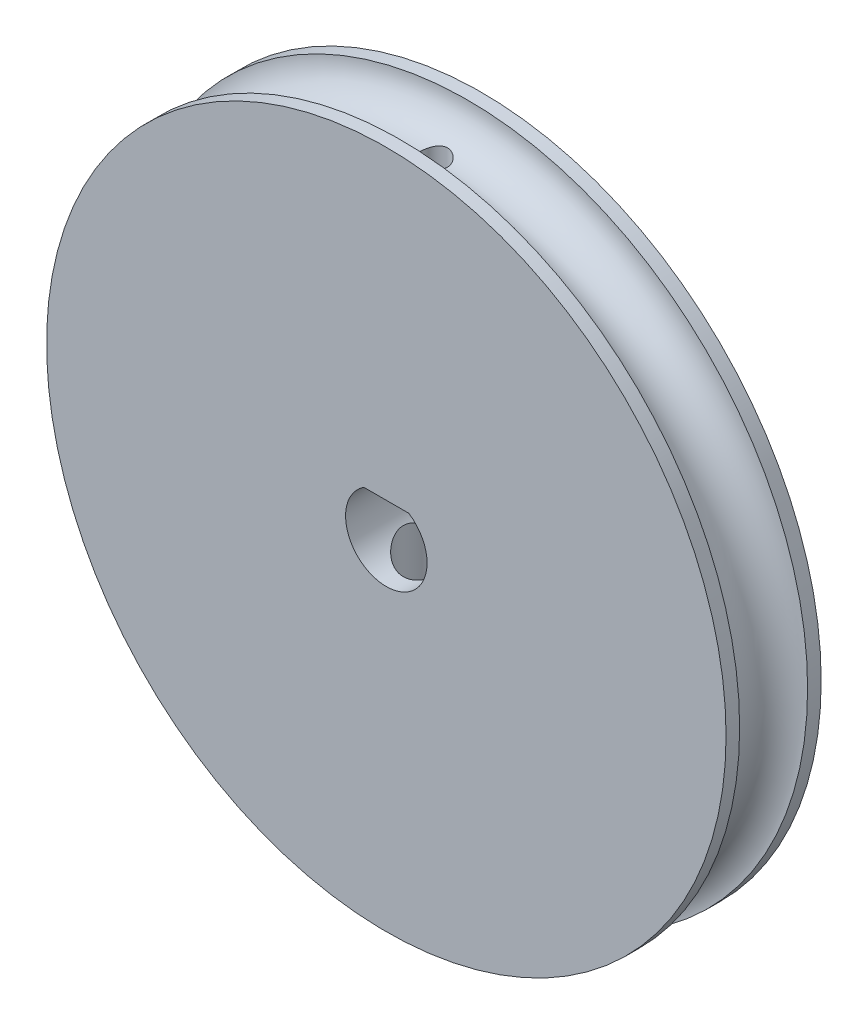
ISO-10303-21;
HEADER;
FILE_DESCRIPTION(('STEP AP214'),'2;1');
FILE_NAME('part.step','',(''),(''),'','','');
FILE_SCHEMA(('AUTOMOTIVE_DESIGN { 1 0 10303 214 1 1 1 1 }'));
ENDSEC;
DATA;
#1=APPLICATION_CONTEXT('core data for automotive mechanical design processes');
#2=APPLICATION_PROTOCOL_DEFINITION('international standard','automotive_design',2000,#1);
#3=PRODUCT_CONTEXT('',#1,'mechanical');
#4=PRODUCT('Part','Part','',(#3));
#5=PRODUCT_RELATED_PRODUCT_CATEGORY('part','',(#4));
#6=PRODUCT_DEFINITION_FORMATION('','',#4);
#7=PRODUCT_DEFINITION_CONTEXT('part definition',#1,'design');
#8=PRODUCT_DEFINITION('design','',#6,#7);
#9=PRODUCT_DEFINITION_SHAPE('','',#8);
#10=(LENGTH_UNIT() NAMED_UNIT(*) SI_UNIT(.MILLI.,.METRE.));
#11=(NAMED_UNIT(*) PLANE_ANGLE_UNIT() SI_UNIT($,.RADIAN.));
#12=(NAMED_UNIT(*) SI_UNIT($,.STERADIAN.) SOLID_ANGLE_UNIT());
#13=UNCERTAINTY_MEASURE_WITH_UNIT(LENGTH_MEASURE(1.E-05),#10,'distance_accuracy_value','');
#14=(GEOMETRIC_REPRESENTATION_CONTEXT(3) GLOBAL_UNCERTAINTY_ASSIGNED_CONTEXT((#13)) GLOBAL_UNIT_ASSIGNED_CONTEXT((#10,
#11,#12)) REPRESENTATION_CONTEXT('',''));
#15=CARTESIAN_POINT('',(0.,0.,0.));
#16=DIRECTION('',(0.,0.,1.));
#17=DIRECTION('',(1.,0.,0.));
#18=AXIS2_PLACEMENT_3D('',#15,#16,#17);
#19=CARTESIAN_POINT('',(0.,0.,0.));
#20=DIRECTION('',(0.,0.,1.));
#21=DIRECTION('',(1.,0.,0.));
#22=AXIS2_PLACEMENT_3D('',#19,#20,#21);
#23=PLANE('',#22);
#24=CARTESIAN_POINT('',(0.,0.,0.));
#25=DIRECTION('',(0.,0.,1.));
#26=DIRECTION('',(1.,0.,0.));
#27=AXIS2_PLACEMENT_3D('',#24,#25,#26);
#28=CIRCLE('',#27,3.);
#29=CARTESIAN_POINT('',(-1.6583123951777,2.5,0.));
#30=VERTEX_POINT('',#29);
#31=CARTESIAN_POINT('',(1.6583123951777,2.5,0.));
#32=VERTEX_POINT('',#31);
#33=EDGE_CURVE('E53',#30,#32,#28,.T.);
#34=ORIENTED_EDGE('',*,*,#33,.F.);
#35=DIRECTION('',(-1.,0.,0.));
#36=VECTOR('',#35,1.);
#37=CARTESIAN_POINT('',(-1.6583123951777,2.5,0.));
#38=LINE('',#37,#36);
#39=EDGE_CURVE('E73',#32,#30,#38,.T.);
#40=ORIENTED_EDGE('',*,*,#39,.F.);
#41=EDGE_LOOP('',(#34,#40));
#42=FACE_BOUND('',#41,.T.);
#43=CARTESIAN_POINT('',(0.,0.,0.));
#44=DIRECTION('',(0.,0.,1.));
#45=DIRECTION('',(1.,0.,0.));
#46=AXIS2_PLACEMENT_3D('',#43,#44,#45);
#47=CIRCLE('',#46,25.);
#48=CARTESIAN_POINT('',(25.,0.,0.));
#49=VERTEX_POINT('',#48);
#50=EDGE_CURVE('E11',#49,#49,#47,.T.);
#51=ORIENTED_EDGE('',*,*,#50,.T.);
#52=EDGE_LOOP('',(#51));
#53=FACE_BOUND('',#52,.T.);
#54=ADVANCED_FACE('F33',(#42,#53),#23,.T.);
#55=CARTESIAN_POINT('',(0.,0.,0.));
#56=DIRECTION('',(0.,0.,1.));
#57=DIRECTION('',(1.,0.,0.));
#58=AXIS2_PLACEMENT_3D('',#55,#56,#57);
#59=CYLINDRICAL_SURFACE('',#58,25.);
#60=CARTESIAN_POINT('',(0.,0.,-1.));
#61=DIRECTION('',(0.,0.,1.));
#62=DIRECTION('',(1.,0.,0.));
#63=AXIS2_PLACEMENT_3D('',#60,#61,#62);
#64=CIRCLE('',#63,25.);
#65=CARTESIAN_POINT('',(25.,0.,-1.));
#66=VERTEX_POINT('',#65);
#67=EDGE_CURVE('E45',#66,#66,#64,.T.);
#68=ORIENTED_EDGE('',*,*,#67,.T.);
#69=EDGE_LOOP('',(#68));
#70=FACE_BOUND('',#69,.T.);
#71=ORIENTED_EDGE('',*,*,#50,.F.);
#72=EDGE_LOOP('',(#71));
#73=FACE_BOUND('',#72,.T.);
#74=ADVANCED_FACE('F135',(#70,#73),#59,.T.);
#75=CARTESIAN_POINT('',(0.,0.,-3.5));
#76=DIRECTION('',(0.,0.,1.));
#77=DIRECTION('',(1.,0.,0.));
#78=AXIS2_PLACEMENT_3D('',#75,#76,#77);
#79=TOROIDAL_SURFACE('',#78,25.,2.5);
#80=CARTESIAN_POINT('',(-0.905684362214043,-23.5656466600211,-5.55966886562888));
#81=CARTESIAN_POINT('',(-0.845276799386599,-23.606609672004,-5.58623218504566));
#82=CARTESIAN_POINT('',(-0.782998831617993,-23.6463490097115,-5.61046062535416));
#83=CARTESIAN_POINT('',(-0.653960599625149,-23.7213327733133,-5.65394409239499));
#84=CARTESIAN_POINT('',(-0.587196443883645,-23.756573217792,-5.67319472912424));
#85=CARTESIAN_POINT('',(-0.458621947095505,-23.8145688471416,-5.70360446003382));
#86=CARTESIAN_POINT('',(-0.397491947503787,-23.8383926611185,-5.71553119624699));
#87=CARTESIAN_POINT('',(-0.271767312946008,-23.8770220076436,-5.73442298942127));
#88=CARTESIAN_POINT('',(-0.2071855333232,-23.8918587674811,-5.74140524143777));
#89=CARTESIAN_POINT('',(-0.0867522044668946,-23.9080836267866,-5.74899762690574));
#90=CARTESIAN_POINT('',(-0.0312075153957531,-23.9112793769513,-5.75046552580382));
#91=CARTESIAN_POINT('',(0.0796262547385471,-23.9087088690604,-5.74927398070473));
#92=CARTESIAN_POINT('',(0.134915288664316,-23.9029410195955,-5.74661380380362));
#93=CARTESIAN_POINT('',(0.25819675345614,-23.8808723727515,-5.73620636357655));
#94=CARTESIAN_POINT('',(0.325644821548747,-23.8621728272081,-5.72729165285515));
#95=CARTESIAN_POINT('',(0.456540155161627,-23.8158526266021,-5.70420774883221));
#96=CARTESIAN_POINT('',(0.519970029766967,-23.7881959909252,-5.69001732841704));
#97=CARTESIAN_POINT('',(0.638204976090172,-23.7296255359802,-5.65839085590347));
#98=CARTESIAN_POINT('',(0.693300386751051,-23.6991092629965,-5.64127636961871));
#99=CARTESIAN_POINT('',(0.800499963331534,-23.6350841088302,-5.60355113092116));
#100=CARTESIAN_POINT('',(0.852601387796474,-23.6015725545441,-5.58293724045341));
#101=CARTESIAN_POINT('',(1.00508996142126,-23.4983754329731,-5.516100397765));
#102=CARTESIAN_POINT('',(1.10155590315058,-23.4260856317456,-5.46491176606377));
#103=CARTESIAN_POINT('',(1.29710277120517,-23.2714379332762,-5.34253041900418));
#104=CARTESIAN_POINT('',(1.39500518054878,-23.1889503487632,-5.26963764979485));
#105=CARTESIAN_POINT('',(1.57946008898809,-23.0279608869992,-5.10712951245491));
#106=CARTESIAN_POINT('',(1.66602846658637,-22.9494535302506,-5.0175379747689));
#107=CARTESIAN_POINT('',(1.81229628641144,-22.8138360166235,-4.83758475465668));
#108=CARTESIAN_POINT('',(1.87406117141642,-22.7553581248259,-4.74994864502512));
#109=CARTESIAN_POINT('',(1.98632427731234,-22.6477006043725,-4.56250119659411));
#110=CARTESIAN_POINT('',(2.0368356301895,-22.598510148349,-4.46270426122568));
#111=CARTESIAN_POINT('',(2.1153868557329,-22.5213870623894,-4.27209442073183));
#112=CARTESIAN_POINT('',(2.14587771163354,-22.4911874372536,-4.18322141096388));
#113=CARTESIAN_POINT('',(2.19589515964301,-22.4414452639829,-3.99957543192857));
#114=CARTESIAN_POINT('',(2.21543093808161,-22.4218937872894,-3.90480748015116));
#115=CARTESIAN_POINT('',(2.24220391919322,-22.3950608918368,-3.71122147831348));
#116=CARTESIAN_POINT('',(2.24936893937622,-22.3878514902544,-3.61238308009866));
#117=CARTESIAN_POINT('',(2.25055045671377,-22.3866641892988,-3.41455072978496));
#118=CARTESIAN_POINT('',(2.24456876939896,-22.3926844629372,-3.31555680105108));
#119=CARTESIAN_POINT('',(2.22111600248391,-22.4162000090518,-3.12970410760166));
#120=CARTESIAN_POINT('',(2.20473941741539,-22.43260177693,-3.04256054322944));
#121=CARTESIAN_POINT('',(2.16261557321133,-22.4745669649141,-2.87290711790452));
#122=CARTESIAN_POINT('',(2.1368648497207,-22.5001337720459,-2.79039898307474));
#123=CARTESIAN_POINT('',(2.06633344701226,-22.5696540023736,-2.60209042540956));
#124=CARTESIAN_POINT('',(2.01803722053166,-22.6169120082116,-2.49882763045793));
#125=CARTESIAN_POINT('',(1.90940882894491,-22.7216584466702,-2.30454591986361));
#126=CARTESIAN_POINT('',(1.8490504489268,-22.7791691317322,-2.21355440789987));
#127=CARTESIAN_POINT('',(1.69473106357906,-22.9233386163084,-2.01279007575779));
#128=CARTESIAN_POINT('',(1.59656275939656,-23.0129545140483,-1.90835874674137));
#129=CARTESIAN_POINT('',(1.43832109216998,-23.1511826133116,-1.76832495432345));
#130=CARTESIAN_POINT('',(1.38367316412264,-23.1979486486798,-1.72437495805392));
#131=CARTESIAN_POINT('',(1.2707366858235,-23.29181929891,-1.64187926736253));
#132=CARTESIAN_POINT('',(1.21244952654415,-23.3389237783948,-1.60333152617038));
#133=CARTESIAN_POINT('',(1.06781636542165,-23.4513034994225,-1.51708010893086));
#134=CARTESIAN_POINT('',(0.979631775226895,-23.5162484731217,-1.47195029409694));
#135=CARTESIAN_POINT('',(0.84093503596756,-23.6090600883206,-1.41245637495241));
#136=CARTESIAN_POINT('',(0.793674787165964,-23.639206485375,-1.39400381880671));
#137=CARTESIAN_POINT('',(0.696693862558344,-23.6970346286907,-1.35996258629462));
#138=CARTESIAN_POINT('',(0.646974807404207,-23.7247179655911,-1.3443720546183));
#139=CARTESIAN_POINT('',(0.539112258041346,-23.7791920637615,-1.31474877889594));
#140=CARTESIAN_POINT('',(0.480643825993066,-23.8055492573531,-1.30107633403278));
#141=CARTESIAN_POINT('',(0.360140480038509,-23.8510297831425,-1.27816786701444));
#142=CARTESIAN_POINT('',(0.298113907040084,-23.8701692958586,-1.2689219089055));
#143=CARTESIAN_POINT('',(0.181055213343266,-23.895947995902,-1.25665093634746));
#144=CARTESIAN_POINT('',(0.126441612066745,-23.9040715474113,-1.25288041700398));
#145=CARTESIAN_POINT('',(0.0165024390568945,-23.9115827006295,-1.24939048788171));
#146=CARTESIAN_POINT('',(-0.0388224045511231,-23.9109786205012,-1.24966722073616));
#147=CARTESIAN_POINT('',(-0.148335422630719,-23.9011843625689,-1.25422647145746));
#148=CARTESIAN_POINT('',(-0.202526372883632,-23.8920185101541,-1.25849764052168));
#149=CARTESIAN_POINT('',(-0.308816526301291,-23.8666125227873,-1.27064914434058));
#150=CARTESIAN_POINT('',(-0.360911873593776,-23.8503599453282,-1.27853582828687));
#151=CARTESIAN_POINT('',(-0.50337166494985,-23.7975759880006,-1.30504518829058));
#152=CARTESIAN_POINT('',(-0.59087364066358,-23.7552406668355,-1.32720341852517));
#153=CARTESIAN_POINT('',(-0.758660165583636,-23.6621155738737,-1.37992354969824));
#154=CARTESIAN_POINT('',(-0.838908360270143,-23.6112865011224,-1.41052496734152));
#155=CARTESIAN_POINT('',(-0.985129551379617,-23.5114068951509,-1.47572103738012));
#156=CARTESIAN_POINT('',(-1.05171363445148,-23.4627403134805,-1.50954698428325));
#157=CARTESIAN_POINT('',(-1.18063199531123,-23.3642450129215,-1.58319912127894));
#158=CARTESIAN_POINT('',(-1.24296317388919,-23.3144154813086,-1.62302962062991));
#159=CARTESIAN_POINT('',(-1.36347524186548,-23.2150635809652,-1.70866303064398));
#160=CARTESIAN_POINT('',(-1.42166140582906,-23.1655408978246,-1.75445813342651));
#161=CARTESIAN_POINT('',(-1.53387469814397,-23.0678678298087,-1.8521945016232));
#162=CARTESIAN_POINT('',(-1.58790164961183,-23.0197175033521,-1.90413602819513));
#163=CARTESIAN_POINT('',(-1.71602400171866,-22.9035972343395,-2.04048090835091));
#164=CARTESIAN_POINT('',(-1.78751286268186,-22.8370347876517,-2.12861168859632));
#165=CARTESIAN_POINT('',(-1.91856794049982,-22.7130227087801,-2.31894531389023));
#166=CARTESIAN_POINT('',(-1.97815743594506,-22.6555553306529,-2.42112001018527));
#167=CARTESIAN_POINT('',(-2.0706439095415,-22.5654303285159,-2.61471669171021));
#168=CARTESIAN_POINT('',(-2.10653001550015,-22.5300981071767,-2.70344785191155));
#169=CARTESIAN_POINT('',(-2.16734056308951,-22.4699061225627,-2.88799604049062));
#170=CARTESIAN_POINT('',(-2.1922726239733,-22.4450390805816,-2.98380808928588));
#171=CARTESIAN_POINT('',(-2.22955255011021,-22.4077641498669,-3.18104972639968));
#172=CARTESIAN_POINT('',(-2.24180471173351,-22.3954510240686,-3.28251603093883));
#173=CARTESIAN_POINT('',(-2.25228310651999,-22.3849244752565,-3.48688757402121));
#174=CARTESIAN_POINT('',(-2.25051631552376,-22.3867040397093,-3.58979207147423));
#175=CARTESIAN_POINT('',(-2.23417435097152,-22.403109580157,-3.78126775722226));
#176=CARTESIAN_POINT('',(-2.22111778907987,-22.4162123331291,-3.87011033558875));
#177=CARTESIAN_POINT('',(-2.18512415774984,-22.4521644625275,-4.04369046991814));
#178=CARTESIAN_POINT('',(-2.16218396832122,-22.4750169166449,-4.12842672022138));
#179=CARTESIAN_POINT('',(-2.099385231541,-22.5371609406288,-4.31715710180054));
#180=CARTESIAN_POINT('',(-2.05650520304843,-22.5793366470328,-4.41919255823256));
#181=CARTESIAN_POINT('',(-1.95890319210458,-22.6741128687269,-4.61218521392765));
#182=CARTESIAN_POINT('',(-1.90415445998855,-22.7267369095404,-4.70311665118596));
#183=CARTESIAN_POINT('',(-1.76320816142142,-22.8599149453328,-4.90493319811577));
#184=CARTESIAN_POINT('',(-1.67285188664467,-22.9436203972723,-5.01084605549597));
#185=CARTESIAN_POINT('',(-1.52684396676396,-23.0739630958954,-5.15405416209995));
#186=CARTESIAN_POINT('',(-1.47640320884768,-23.1182297573069,-5.19919732593075));
#187=CARTESIAN_POINT('',(-1.37213673668919,-23.2076086568761,-5.28445308436503));
#188=CARTESIAN_POINT('',(-1.31831237952689,-23.2527205509994,-5.32456767672168));
#189=CARTESIAN_POINT('',(-1.20685714668086,-23.3432685260291,-5.40014965460478));
#190=CARTESIAN_POINT('',(-1.1491994785019,-23.388704342,-5.43557768031012));
#191=CARTESIAN_POINT('',(-1.03027308083092,-23.4784234471794,-5.50141347573302));
#192=CARTESIAN_POINT('',(-0.969006340133034,-23.5227073521122,-5.53182397590257));
#193=CARTESIAN_POINT('',(-0.905684362214043,-23.5656466600211,-5.55966886562888));
#194=B_SPLINE_CURVE_WITH_KNOTS('',3,(#80,#81,#82,#83,#84,#85,#86,#87,#88,#89,#90,#91,#92,#93,
#94,#95,#96,#97,#98,#99,#100,#101,#102,#103,#104,#105,#106,#107,#108,#109,#110,#111,#112,#113,
#114,#115,#116,#117,#118,#119,#120,#121,#122,#123,#124,#125,#126,#127,#128,#129,#130,#131,#132,
#133,#134,#135,#136,#137,#138,#139,#140,#141,#142,#143,#144,#145,#146,#147,#148,#149,#150,#151,
#152,#153,#154,#155,#156,#157,#158,#159,#160,#161,#162,#163,#164,#165,#166,#167,#168,#169,#170,
#171,#172,#173,#174,#175,#176,#177,#178,#179,#180,#181,#182,#183,#184,#185,#186,#187,#188,#189,
#190,#191,#192,#193),.UNSPECIFIED.,.T.,.F.,(4,2,2,2,2,2,2,2,2,2,2,2,2,2,2,2,2,2,2,2,2,2,2,2,2,2,
2,2,2,2,2,2,2,2,2,2,2,2,2,2,2,2,2,2,2,2,2,2,2,2,2,2,2,2,2,2,4),(0.,0.23293920876547,
0.46608315496488,0.665503433936973,0.864226752451301,1.03033350954015,1.19646976081265,
1.40691169135514,1.61820967549567,1.81372632677014,2.00941924082052,2.40117366672023,
2.84186294155634,3.2819280678669,3.64710532901158,4.01185419870387,4.3067466869101,
4.60139152318507,4.89774985290528,5.19406725878041,5.46343331569019,5.732899022142,
6.10106281480433,6.47003562123308,6.97425741161465,7.22694998118912,7.47954655195995,
7.83397645051571,8.01089731081618,8.18770307385918,8.38396800093745,8.57979029025172,
8.7450615248242,8.91017525248685,9.07482128742556,9.23975757078603,9.53714133836269,
9.83594128008069,10.1030232581683,10.3702978323027,10.6372259862307,10.9041654858468,
11.2974663745131,11.6899901486235,11.9948951104802,12.2995876539824,12.6065635042048,
12.9133866126132,13.184407834579,13.4555146732706,13.8088872276649,14.1630646497531,
14.6475861851414,14.8900723267834,15.1324618260377,15.3767727798274,15.620950342098),.UNSPECIFIED.);
#195=CARTESIAN_POINT('',(-0.905684362214043,-23.5656466600211,-5.55966886562888));
#196=VERTEX_POINT('',#195);
#197=EDGE_CURVE('E95',#196,#196,#194,.T.);
#198=ORIENTED_EDGE('',*,*,#197,.F.);
#199=EDGE_LOOP('',(#198));
#200=FACE_BOUND('',#199,.T.);
#201=CARTESIAN_POINT('',(-0.738694649379842,22.5805005433115,-4.17404066112833));
#202=CARTESIAN_POINT('',(-0.77554593244392,22.5679815782575,-4.13365125032186));
#203=CARTESIAN_POINT('',(-0.809150499626964,22.5557091929817,-4.09016432087452));
#204=CARTESIAN_POINT('',(-0.869000527795818,22.5328886048857,-3.99786561625656));
#205=CARTESIAN_POINT('',(-0.89523215169048,22.5223436592816,-3.94904406462808));
#206=CARTESIAN_POINT('',(-0.939466532944852,22.5040875289897,-3.84712221288909));
#207=CARTESIAN_POINT('',(-0.957447241639842,22.4963839478342,-3.79401088910454));
#208=CARTESIAN_POINT('',(-0.98430135652763,22.4847389851244,-3.68516798103711));
#209=CARTESIAN_POINT('',(-0.993183441819307,22.4807940185115,-3.62943894694906));
#210=CARTESIAN_POINT('',(-1.00119830764476,22.4772360395935,-3.52040061377002));
#211=CARTESIAN_POINT('',(-1.00086553206748,22.4773855497962,-3.46713791632365));
#212=CARTESIAN_POINT('',(-0.9917780902998,22.4814155939319,-3.36148123803991));
#213=CARTESIAN_POINT('',(-0.983023244856463,22.4852962072765,-3.3090872757166));
#214=CARTESIAN_POINT('',(-0.957808303906412,22.4962243702649,-3.20803106368147));
#215=CARTESIAN_POINT('',(-0.941556341888333,22.5031861807073,-3.15930697870932));
#216=CARTESIAN_POINT('',(-0.902002688258713,22.519580254048,-3.06526404119222));
#217=CARTESIAN_POINT('',(-0.878699464328366,22.5290130538603,-3.01994593147908));
#218=CARTESIAN_POINT('',(-0.824089258382174,22.5501282681381,-2.93099729486466));
#219=CARTESIAN_POINT('',(-0.792381369975509,22.5619126793762,-2.88763748514373));
#220=CARTESIAN_POINT('',(-0.722562180862737,22.5861825210673,-2.80662669145456));
#221=CARTESIAN_POINT('',(-0.684447412601266,22.5986683286831,-2.76897882002912));
#222=CARTESIAN_POINT('',(-0.599683066145364,22.6240087069161,-2.69771651887404));
#223=CARTESIAN_POINT('',(-0.552619375911099,22.6368263939104,-2.66457907992547));
#224=CARTESIAN_POINT('',(-0.453103944715813,22.6603707512333,-2.60668710504735));
#225=CARTESIAN_POINT('',(-0.400653223128582,22.6710978160558,-2.58193098693768));
#226=CARTESIAN_POINT('',(-0.292976386387828,22.688826195968,-2.54220123818496));
#227=CARTESIAN_POINT('',(-0.237843706490066,22.695908678736,-2.52701263039395));
#228=CARTESIAN_POINT('',(-0.125434163389783,22.705685635408,-2.50625678323366));
#229=CARTESIAN_POINT('',(-0.0681591492294092,22.7083838078999,-2.50068143391238));
#230=CARTESIAN_POINT('',(0.0412418699991142,22.7089566170372,-2.4994929701681));
#231=CARTESIAN_POINT('',(0.0933584785341219,22.7072508358894,-2.50301329918468));
#232=CARTESIAN_POINT('',(0.196157780606171,22.7001141367507,-2.51805255948954));
#233=CARTESIAN_POINT('',(0.246840351868844,22.6946829020966,-2.52957217071701));
#234=CARTESIAN_POINT('',(0.344836141711239,22.6808448935426,-2.55995164819991));
#235=CARTESIAN_POINT('',(0.392181959969899,22.6724738422616,-2.57872365105755));
#236=CARTESIAN_POINT('',(0.483157388758836,22.653646597355,-2.62300467147151));
#237=CARTESIAN_POINT('',(0.526785737054301,22.6431896994931,-2.64851596533545));
#238=CARTESIAN_POINT('',(0.613084524310814,22.6202474054244,-2.70809901409125));
#239=CARTESIAN_POINT('',(0.655352249754741,22.6076649621018,-2.74271712869845));
#240=CARTESIAN_POINT('',(0.733723043138922,22.5825121794675,-2.81837014557015));
#241=CARTESIAN_POINT('',(0.769823273596736,22.5699418483588,-2.85940798481717));
#242=CARTESIAN_POINT('',(0.836872883773396,22.5453820446241,-2.94956855434198));
#243=CARTESIAN_POINT('',(0.867412081062917,22.5334663685899,-2.99901853171165));
#244=CARTESIAN_POINT('',(0.919630000515485,22.5124093337073,-3.10293881772601));
#245=CARTESIAN_POINT('',(0.941312646849653,22.5032667466187,-3.1574068898079));
#246=CARTESIAN_POINT('',(0.974071470757615,22.4892225361299,-3.26699587476852));
#247=CARTESIAN_POINT('',(0.985619673572416,22.4841333342307,-3.32195091662089));
#248=CARTESIAN_POINT('',(0.999340007830023,22.4780697956617,-3.43323268831839));
#249=CARTESIAN_POINT('',(1.00151703729386,22.4770933094091,-3.48955868612128));
#250=CARTESIAN_POINT('',(0.996589715334856,22.4792822577082,-3.59753900312227));
#251=CARTESIAN_POINT('',(0.990157181326249,22.4821479130903,-3.64923183978173));
#252=CARTESIAN_POINT('',(0.969446072338762,22.4912010579052,-3.75071201667379));
#253=CARTESIAN_POINT('',(0.955167025102679,22.4973887472803,-3.80049924202064));
#254=CARTESIAN_POINT('',(0.919152203557241,22.512534801134,-3.89730275716691));
#255=CARTESIAN_POINT('',(0.897356674076127,22.5215153102214,-3.94429319091568));
#256=CARTESIAN_POINT('',(0.847012716399465,22.5413870574273,-4.03406023763713));
#257=CARTESIAN_POINT('',(0.818461961695377,22.5522789534953,-4.07683539165654));
#258=CARTESIAN_POINT('',(0.75285842719025,22.5758876620957,-4.1604874759182));
#259=CARTESIAN_POINT('',(0.715318771710423,22.5886804676418,-4.20096152073348));
#260=CARTESIAN_POINT('',(0.634055202896366,22.6140703799442,-4.27524641801516));
#261=CARTESIAN_POINT('',(0.590328276696634,22.6266673880213,-4.3090540049665));
#262=CARTESIAN_POINT('',(0.495457616515976,22.6508647618488,-4.37055167530666));
#263=CARTESIAN_POINT('',(0.444065633989309,22.6623928792851,-4.39788989789323));
#264=CARTESIAN_POINT('',(0.336793505943173,22.6822563525166,-4.44337570242926));
#265=CARTESIAN_POINT('',(0.280916430283918,22.6905938699784,-4.46152950961643));
#266=CARTESIAN_POINT('',(0.169947278159802,22.702466908852,-4.48699182760231));
#267=CARTESIAN_POINT('',(0.115023608835554,22.7062695005758,-4.49490614753993));
#268=CARTESIAN_POINT('',(0.00451329497566122,22.7094386910269,-4.501518389725));
#269=CARTESIAN_POINT('',(-0.0510729401763168,22.7088079002428,-4.50022173562382));
#270=CARTESIAN_POINT('',(-0.15674297555416,22.7034332017338,-4.4889565748853));
#271=CARTESIAN_POINT('',(-0.206918572547254,22.6990128956965,-4.47967012981157));
#272=CARTESIAN_POINT('',(-0.304951300560237,22.6870259325439,-4.4537178898972));
#273=CARTESIAN_POINT('',(-0.352806817318851,22.6794571188738,-4.4370470366337));
#274=CARTESIAN_POINT('',(-0.446650861035596,22.6617075969989,-4.39622066507791));
#275=CARTESIAN_POINT('',(-0.492522076521463,22.6514474452518,-4.37183179043601));
#276=CARTESIAN_POINT('',(-0.579647198274723,22.6295303273219,-4.31649668968991));
#277=CARTESIAN_POINT('',(-0.620908230862761,22.6178755763016,-4.28556080423001));
#278=CARTESIAN_POINT('',(-0.687320758668559,22.5975607246163,-4.22729763956741));
#279=CARTESIAN_POINT('',(-0.713751431818888,22.5889741497376,-4.20137870141184));
#280=CARTESIAN_POINT('',(-0.738694649379842,22.5805005433115,-4.17404066112833));
#281=B_SPLINE_CURVE_WITH_KNOTS('',3,(#201,#202,#203,#204,#205,#206,#207,#208,#209,#210,#211,
#212,#213,#214,#215,#216,#217,#218,#219,#220,#221,#222,#223,#224,#225,#226,#227,#228,#229,#230,
#231,#232,#233,#234,#235,#236,#237,#238,#239,#240,#241,#242,#243,#244,#245,#246,#247,#248,#249,
#250,#251,#252,#253,#254,#255,#256,#257,#258,#259,#260,#261,#262,#263,#264,#265,#266,#267,#268,
#269,#270,#271,#272,#273,#274,#275,#276,#277,#278,#279,#280),.UNSPECIFIED.,.T.,.F.,(4,2,2,2,2,2,
2,2,2,2,2,2,2,2,2,2,2,2,2,2,2,2,2,2,2,2,2,2,2,2,2,2,2,2,2,2,2,2,2,4),(0.,0.168154746348075,
0.336622999607719,0.505538860540164,0.674293443616455,0.833282253811413,0.992274447953768,
1.14709625088809,1.30195172254001,1.46623503723214,1.6306075539343,1.80666512102559,
1.98268943437199,2.15460248506688,2.32637043511922,2.48238914481959,2.63842111773781,
2.79261920296805,2.94686943790763,3.11434244147316,3.28189228814085,3.45897971183043,
3.63598858607659,3.80423273935769,3.97238894596387,4.1281594604531,4.28393935131169,
4.44098736675914,4.59808954868442,4.76734603989868,4.93668523531222,5.11379418382489,
5.29078292573093,5.45673274326071,5.62258485350016,5.77554221124473,5.92860450934528,
6.08682635584991,6.24480014021398,6.35861762696942),.UNSPECIFIED.);
#282=CARTESIAN_POINT('',(-0.738694649379842,22.5805005433115,-4.17404066112833));
#283=VERTEX_POINT('',#282);
#284=EDGE_CURVE('E78',#283,#283,#281,.T.);
#285=ORIENTED_EDGE('',*,*,#284,.F.);
#286=EDGE_LOOP('',(#285));
#287=FACE_BOUND('',#286,.T.);
#288=CARTESIAN_POINT('',(0.,0.,-6.));
#289=DIRECTION('',(0.,0.,1.));
#290=DIRECTION('',(1.,0.,0.));
#291=AXIS2_PLACEMENT_3D('',#288,#289,#290);
#292=CIRCLE('',#291,25.);
#293=CARTESIAN_POINT('',(25.,0.,-6.));
#294=VERTEX_POINT('',#293);
#295=EDGE_CURVE('E90',#294,#294,#292,.T.);
#296=ORIENTED_EDGE('',*,*,#295,.T.);
#297=EDGE_LOOP('',(#296));
#298=FACE_BOUND('',#297,.T.);
#299=ORIENTED_EDGE('',*,*,#67,.F.);
#300=EDGE_LOOP('',(#299));
#301=FACE_BOUND('',#300,.T.);
#302=ADVANCED_FACE('F109',(#200,#287,#298,#301),#79,.F.);
#303=CARTESIAN_POINT('',(0.,0.,0.));
#304=DIRECTION('',(0.,0.,1.));
#305=DIRECTION('',(1.,0.,0.));
#306=AXIS2_PLACEMENT_3D('',#303,#304,#305);
#307=CYLINDRICAL_SURFACE('',#306,25.);
#308=CARTESIAN_POINT('',(0.,0.,-7.));
#309=DIRECTION('',(0.,0.,1.));
#310=DIRECTION('',(1.,0.,0.));
#311=AXIS2_PLACEMENT_3D('',#308,#309,#310);
#312=CIRCLE('',#311,25.);
#313=CARTESIAN_POINT('',(25.,0.,-7.));
#314=VERTEX_POINT('',#313);
#315=EDGE_CURVE('E69',#314,#314,#312,.T.);
#316=ORIENTED_EDGE('',*,*,#315,.T.);
#317=EDGE_LOOP('',(#316));
#318=FACE_BOUND('',#317,.T.);
#319=ORIENTED_EDGE('',*,*,#295,.F.);
#320=EDGE_LOOP('',(#319));
#321=FACE_BOUND('',#320,.T.);
#322=ADVANCED_FACE('F128',(#318,#321),#307,.T.);
#323=CARTESIAN_POINT('',(0.,0.,-7.));
#324=DIRECTION('',(0.,0.,-1.));
#325=DIRECTION('',(-1.,0.,0.));
#326=AXIS2_PLACEMENT_3D('',#323,#324,#325);
#327=PLANE('',#326);
#328=CARTESIAN_POINT('',(0.,0.,-7.));
#329=DIRECTION('',(0.,0.,1.));
#330=DIRECTION('',(1.,0.,0.));
#331=AXIS2_PLACEMENT_3D('',#328,#329,#330);
#332=CIRCLE('',#331,3.);
#333=CARTESIAN_POINT('',(-1.6583123951777,2.5,-7.));
#334=VERTEX_POINT('',#333);
#335=CARTESIAN_POINT('',(1.6583123951777,2.5,-7.));
#336=VERTEX_POINT('',#335);
#337=EDGE_CURVE('E58',#334,#336,#332,.T.);
#338=ORIENTED_EDGE('',*,*,#337,.T.);
#339=DIRECTION('',(-1.,0.,0.));
#340=VECTOR('',#339,1.);
#341=CARTESIAN_POINT('',(-1.6583123951777,2.5,-7.));
#342=LINE('',#341,#340);
#343=EDGE_CURVE('E84',#336,#334,#342,.T.);
#344=ORIENTED_EDGE('',*,*,#343,.T.);
#345=EDGE_LOOP('',(#338,#344));
#346=FACE_BOUND('',#345,.T.);
#347=ORIENTED_EDGE('',*,*,#315,.F.);
#348=EDGE_LOOP('',(#347));
#349=FACE_BOUND('',#348,.T.);
#350=ADVANCED_FACE('F125',(#346,#349),#327,.T.);
#351=CARTESIAN_POINT('',(0.,0.,-7.));
#352=DIRECTION('',(0.,0.,1.));
#353=DIRECTION('',(1.,0.,0.));
#354=AXIS2_PLACEMENT_3D('',#351,#352,#353);
#355=CYLINDRICAL_SURFACE('',#354,3.);
#356=CARTESIAN_POINT('',(0.,-3.,-1.25));
#357=CARTESIAN_POINT('',(-0.109830944435744,-2.99999301890879,-1.25000728598635));
#358=CARTESIAN_POINT('',(-0.219841550299105,-2.99390466035436,-1.25810756283801));
#359=CARTESIAN_POINT('',(-0.436404637270398,-2.97009913181274,-1.29000056877283));
#360=CARTESIAN_POINT('',(-0.542947715792825,-2.9523527262368,-1.31383275043498));
#361=CARTESIAN_POINT('',(-0.748851928566447,-2.90693511833825,-1.37556937092339));
#362=CARTESIAN_POINT('',(-0.848252420047545,-2.87932427736715,-1.41338827223414));
#363=CARTESIAN_POINT('',(-1.0386335063383,-2.81625835243792,-1.50131351440101));
#364=CARTESIAN_POINT('',(-1.1296165535476,-2.78080556348222,-1.55141626076571));
#365=CARTESIAN_POINT('',(-1.31019890545311,-2.7007431676681,-1.66739451795938));
#366=CARTESIAN_POINT('',(-1.39888984365659,-2.65558962809396,-1.73430099415572));
#367=CARTESIAN_POINT('',(-1.5645407517669,-2.5615052683835,-1.8792437558869));
#368=CARTESIAN_POINT('',(-1.64148222415654,-2.51256867121772,-1.95729722415477));
#369=CARTESIAN_POINT('',(-1.79755742146132,-2.40406685473343,-2.14037442997167));
#370=CARTESIAN_POINT('',(-1.87395867629482,-2.34436282295732,-2.24765551569685));
#371=CARTESIAN_POINT('',(-2.00792997266843,-2.23067166997427,-2.47617651853555));
#372=CARTESIAN_POINT('',(-2.06552575475116,-2.17667680325777,-2.59739704549739));
#373=CARTESIAN_POINT('',(-2.14320941717354,-2.09965732770095,-2.80925425801637));
#374=CARTESIAN_POINT('',(-2.16938511684721,-2.07236626780054,-2.89608604569311));
#375=CARTESIAN_POINT('',(-2.21131008847354,-2.02757391226074,-3.07458910217684));
#376=CARTESIAN_POINT('',(-2.22708323032924,-2.0100502186626,-3.16624876681204));
#377=CARTESIAN_POINT('',(-2.24719233212144,-1.98755639526816,-3.3532738782963));
#378=CARTESIAN_POINT('',(-2.25142432281304,-1.98270040014893,-3.44866521008612));
#379=CARTESIAN_POINT('',(-2.24772319862809,-1.98689297664105,-3.63892236632232));
#380=CARTESIAN_POINT('',(-2.23978572236024,-1.99594653327169,-3.73378799013114));
#381=CARTESIAN_POINT('',(-2.21396608937823,-2.02451434893779,-3.9097870211387));
#382=CARTESIAN_POINT('',(-2.19723729571229,-2.04280735589811,-3.99130455656931));
#383=CARTESIAN_POINT('',(-2.15558506681095,-2.08671289267404,-4.15015831808128));
#384=CARTESIAN_POINT('',(-2.13065375521742,-2.11233245461136,-4.22749044173528));
#385=CARTESIAN_POINT('',(-2.05549596258829,-2.18612653941487,-4.4243845799514));
#386=CARTESIAN_POINT('',(-1.99920222741103,-2.23838473708983,-4.54010062496612));
#387=CARTESIAN_POINT('',(-1.86927034971646,-2.34799947217659,-4.75879478580276));
#388=CARTESIAN_POINT('',(-1.79559006383312,-2.40536818328652,-4.8617410088787));
#389=CARTESIAN_POINT('',(-1.62977406153721,-2.52077508470242,-5.05663008560884));
#390=CARTESIAN_POINT('',(-1.53722063291013,-2.57879380097341,-5.14823091033495));
#391=CARTESIAN_POINT('',(-1.33563378254484,-2.6887205696948,-5.31539547015904));
#392=CARTESIAN_POINT('',(-1.22663258136768,-2.74064022388256,-5.39098988029816));
#393=CARTESIAN_POINT('',(-1.01685312073954,-2.82419589116368,-5.50997119889839));
#394=CARTESIAN_POINT('',(-0.918809805475835,-2.85781156437494,-5.55677689145193));
#395=CARTESIAN_POINT('',(-0.714528259605855,-2.91559356605452,-5.63633732056762));
#396=CARTESIAN_POINT('',(-0.608295210865038,-2.93976581182572,-5.66910085727421));
#397=CARTESIAN_POINT('',(-0.389514349460359,-2.97668383028391,-5.71888004480727));
#398=CARTESIAN_POINT('',(-0.276931924858515,-2.98935889735946,-5.73579827019447));
#399=CARTESIAN_POINT('',(-0.0498018569469435,-3.00173825210962,-5.75232439427179));
#400=CARTESIAN_POINT('',(0.0647449368160491,-3.00144801229871,-5.75193959637867));
#401=CARTESIAN_POINT('',(0.28020631676887,-2.98863821697649,-5.73483370208445));
#402=CARTESIAN_POINT('',(0.381333458495801,-2.97735133223082,-5.71975921599371));
#403=CARTESIAN_POINT('',(0.579166038744055,-2.94526976979194,-5.67653930865694));
#404=CARTESIAN_POINT('',(0.675870531586897,-2.92447306900966,-5.64839110612855));
#405=CARTESIAN_POINT('',(0.866125043119192,-2.87399758821112,-5.57916878624771));
#406=CARTESIAN_POINT('',(0.959443279407911,-2.84403123961185,-5.53767353934253));
#407=CARTESIAN_POINT('',(1.13777827002725,-2.77750429585333,-5.44374100533488));
#408=CARTESIAN_POINT('',(1.22279387353747,-2.74094278853907,-5.39130220450731));
#409=CARTESIAN_POINT('',(1.397265348759,-2.65678931958494,-5.26732648881122));
#410=CARTESIAN_POINT('',(1.48509173584325,-2.60837493640629,-5.19406265400266));
#411=CARTESIAN_POINT('',(1.64808804993022,-2.50857576297244,-5.03598139568651));
#412=CARTESIAN_POINT('',(1.72322910315041,-2.45718454449641,-4.95113838867392));
#413=CARTESIAN_POINT('',(1.83242820730102,-2.37587731395515,-4.80737762743887));
#414=CARTESIAN_POINT('',(1.87080905905423,-2.34568391408796,-4.75185660693922));
#415=CARTESIAN_POINT('',(1.94268582111476,-2.28651392352377,-4.63712995781065));
#416=CARTESIAN_POINT('',(1.97617993664481,-2.25753778266414,-4.57792298675655));
#417=CARTESIAN_POINT('',(2.06880744813235,-2.17413551653953,-4.39506285320002));
#418=CARTESIAN_POINT('',(2.12042150898315,-2.1229720049941,-4.26573361649932));
#419=CARTESIAN_POINT('',(2.1842412077433,-2.05677979889576,-4.04686530988144));
#420=CARTESIAN_POINT('',(2.20396653154992,-2.0354362760625,-3.9614098247408));
#421=CARTESIAN_POINT('',(2.2333714469874,-2.00313174083041,-3.78694290736607));
#422=CARTESIAN_POINT('',(2.24307346186609,-1.99214755826528,-3.69793987706016));
#423=CARTESIAN_POINT('',(2.25173017110868,-1.98236378570869,-3.51825543828299));
#424=CARTESIAN_POINT('',(2.25063030570656,-1.98362605153665,-3.42756782104513));
#425=CARTESIAN_POINT('',(2.23765318164779,-1.99824678696878,-3.24791500665357));
#426=CARTESIAN_POINT('',(2.22576201539397,-2.01162086597183,-3.15895218353168));
#427=CARTESIAN_POINT('',(2.18840754807512,-2.05226023975209,-2.96612800231839));
#428=CARTESIAN_POINT('',(2.16054805514548,-2.08192071109673,-2.86325399917494));
#429=CARTESIAN_POINT('',(2.09204487433698,-2.15074432863459,-2.66519795796599));
#430=CARTESIAN_POINT('',(2.05136889358708,-2.1899314208223,-2.57003612168374));
#431=CARTESIAN_POINT('',(1.94248138097768,-2.28774780830374,-2.35621799730537));
#432=CARTESIAN_POINT('',(1.86961269587429,-2.34840586959811,-2.24086308413859));
#433=CARTESIAN_POINT('',(1.70477122143373,-2.47069982846481,-2.02531547832193));
#434=CARTESIAN_POINT('',(1.6127814105072,-2.53233655177746,-1.92513643350812));
#435=CARTESIAN_POINT('',(1.40940100384305,-2.6509455743742,-1.74073496303549));
#436=CARTESIAN_POINT('',(1.29785685108223,-2.70787527273272,-1.65665076320422));
#437=CARTESIAN_POINT('',(1.11771169521695,-2.78477987786927,-1.5459820614588));
#438=CARTESIAN_POINT('',(1.05555336497513,-2.80899153781361,-1.51167969928845));
#439=CARTESIAN_POINT('',(0.927261095473399,-2.85390938149333,-1.44871056474889));
#440=CARTESIAN_POINT('',(0.861129231124658,-2.87461737359287,-1.42004088391865));
#441=CARTESIAN_POINT('',(0.697302374959343,-2.91952844824081,-1.35832665674854));
#442=CARTESIAN_POINT('',(0.597841236129705,-2.94164913362463,-1.32835655236058));
#443=CARTESIAN_POINT('',(0.394251632006396,-2.97576178739809,-1.28236651534133));
#444=CARTESIAN_POINT('',(0.290137066095123,-2.98778204059468,-1.26630762243344));
#445=CARTESIAN_POINT('',(0.154445366383081,-2.99618186377423,-1.2550932056132));
#446=CARTESIAN_POINT('',(0.123610530612972,-2.99761136260584,-1.25318565240124));
#447=CARTESIAN_POINT('',(0.0618552227968246,-2.99952149023191,-1.25063792150713));
#448=CARTESIAN_POINT('',(0.0309347377671829,-3.00000196627851,-1.24999794784541));
#449=CARTESIAN_POINT('',(0.,-3.,-1.25));
#450=B_SPLINE_CURVE_WITH_KNOTS('',3,(#356,#357,#358,#359,#360,#361,#362,#363,#364,#365,#366,
#367,#368,#369,#370,#371,#372,#373,#374,#375,#376,#377,#378,#379,#380,#381,#382,#383,#384,#385,
#386,#387,#388,#389,#390,#391,#392,#393,#394,#395,#396,#397,#398,#399,#400,#401,#402,#403,#404,
#405,#406,#407,#408,#409,#410,#411,#412,#413,#414,#415,#416,#417,#418,#419,#420,#421,#422,#423,
#424,#425,#426,#427,#428,#429,#430,#431,#432,#433,#434,#435,#436,#437,#438,#439,#440,#441,#442,
#443,#444,#445,#446,#447,#448,#449),.UNSPECIFIED.,.T.,.F.,(4,2,2,2,2,2,2,2,2,2,2,2,2,2,2,2,2,2,
2,2,2,2,2,2,2,2,2,2,2,2,2,2,2,2,2,2,2,2,2,2,2,2,2,2,2,2,4),(0.,0.329357679858063,
0.659544479134865,0.987744500360072,1.31584859827394,1.67433646976144,2.03338302607744,
2.46540023831177,2.8968236108476,3.17999277794852,3.46250989792935,3.74756381431885,
4.03271991450314,4.28740335244063,4.54233206400959,4.95673997708864,5.37216288536833,
5.79803825907135,6.22308993740536,6.56289757509583,6.90249194464675,7.24416087250347,
7.5856855869992,7.89286780517991,8.20011540278718,8.51820659225519,8.83634180966311,
9.20760573122801,9.57970363478177,9.80127517938735,10.0229278979812,10.4644228954937,
10.734236379086,11.0034449444551,11.2740139655631,11.5449321861998,11.874994022144,
12.2058942348408,12.6515826575785,13.0976695436054,13.5474307001318,13.7721264550659,
13.9967058806075,14.3139330396345,14.6302688607589,14.7230200796907,14.8157862259745),.UNSPECIFIED.);
#451=CARTESIAN_POINT('',(0.,-3.,-1.25));
#452=VERTEX_POINT('',#451);
#453=EDGE_CURVE('E36',#452,#452,#450,.T.);
#454=ORIENTED_EDGE('',*,*,#453,.T.);
#455=EDGE_LOOP('',(#454));
#456=FACE_BOUND('',#455,.T.);
#457=ORIENTED_EDGE('',*,*,#33,.T.);
#458=DIRECTION('',(0.,0.,1.));
#459=VECTOR('',#458,1.);
#460=CARTESIAN_POINT('',(1.6583123951777,2.5,-7.));
#461=LINE('',#460,#459);
#462=EDGE_CURVE('E70',#336,#32,#461,.T.);
#463=ORIENTED_EDGE('',*,*,#462,.F.);
#464=ORIENTED_EDGE('',*,*,#337,.F.);
#465=DIRECTION('',(0.,0.,1.));
#466=VECTOR('',#465,1.);
#467=CARTESIAN_POINT('',(-1.6583123951777,2.5,-7.));
#468=LINE('',#467,#466);
#469=EDGE_CURVE('E63',#334,#30,#468,.T.);
#470=ORIENTED_EDGE('',*,*,#469,.T.);
#471=EDGE_LOOP('',(#457,#463,#464,#470));
#472=FACE_BOUND('',#471,.T.);
#473=ADVANCED_FACE('F65',(#456,#472),#355,.F.);
#474=CARTESIAN_POINT('',(-1.6583123951777,2.5,-7.));
#475=DIRECTION('',(0.,1.,0.));
#476=DIRECTION('',(0.,0.,1.));
#477=AXIS2_PLACEMENT_3D('',#474,#475,#476);
#478=PLANE('',#477);
#479=CARTESIAN_POINT('',(0.,2.5,-3.5));
#480=DIRECTION('',(0.,1.,0.));
#481=DIRECTION('',(0.,0.,1.));
#482=AXIS2_PLACEMENT_3D('',#479,#480,#481);
#483=CIRCLE('',#482,1.);
#484=CARTESIAN_POINT('',(0.,2.5,-2.5));
#485=VERTEX_POINT('',#484);
#486=EDGE_CURVE('E81',#485,#485,#483,.T.);
#487=ORIENTED_EDGE('',*,*,#486,.T.);
#488=EDGE_LOOP('',(#487));
#489=FACE_BOUND('',#488,.T.);
#490=ORIENTED_EDGE('',*,*,#39,.T.);
#491=ORIENTED_EDGE('',*,*,#469,.F.);
#492=ORIENTED_EDGE('',*,*,#343,.F.);
#493=ORIENTED_EDGE('',*,*,#462,.T.);
#494=EDGE_LOOP('',(#490,#491,#492,#493));
#495=FACE_BOUND('',#494,.T.);
#496=ADVANCED_FACE('F74',(#489,#495),#478,.F.);
#497=CARTESIAN_POINT('',(0.,-25.,-3.5));
#498=DIRECTION('',(0.,1.,0.));
#499=DIRECTION('',(0.,0.,1.));
#500=AXIS2_PLACEMENT_3D('',#497,#498,#499);
#501=CYLINDRICAL_SURFACE('',#500,1.);
#502=ORIENTED_EDGE('',*,*,#284,.T.);
#503=EDGE_LOOP('',(#502));
#504=FACE_BOUND('',#503,.T.);
#505=ORIENTED_EDGE('',*,*,#486,.F.);
#506=EDGE_LOOP('',(#505));
#507=FACE_BOUND('',#506,.T.);
#508=ADVANCED_FACE('F115',(#504,#507),#501,.F.);
#509=CARTESIAN_POINT('',(0.,-25.,-3.5));
#510=DIRECTION('',(0.,1.,0.));
#511=DIRECTION('',(0.,0.,1.));
#512=AXIS2_PLACEMENT_3D('',#509,#510,#511);
#513=CYLINDRICAL_SURFACE('',#512,2.25);
#514=ORIENTED_EDGE('',*,*,#197,.T.);
#515=EDGE_LOOP('',(#514));
#516=FACE_BOUND('',#515,.T.);
#517=ORIENTED_EDGE('',*,*,#453,.F.);
#518=EDGE_LOOP('',(#517));
#519=FACE_BOUND('',#518,.T.);
#520=ADVANCED_FACE('F112',(#516,#519),#513,.F.);
#521=CLOSED_SHELL('',(#54,#74,#302,#322,#350,#473,#496,#508,#520));
#522=MANIFOLD_SOLID_BREP('B2',#521);
#523=ADVANCED_BREP_SHAPE_REPRESENTATION('',(#18,#522),#14);
#524=SHAPE_DEFINITION_REPRESENTATION(#9,#523);
ENDSEC;
END-ISO-10303-21;
